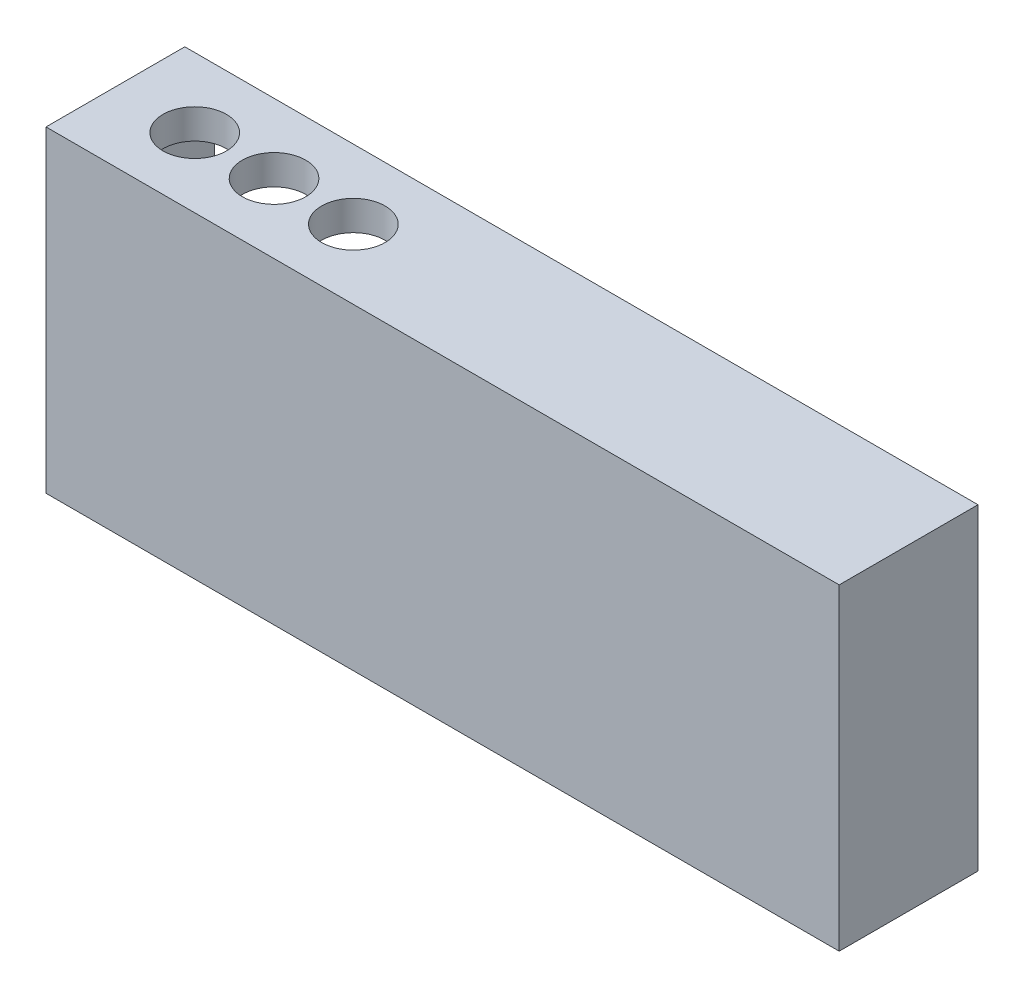
ISO-10303-21;
HEADER;
FILE_DESCRIPTION(('STEP AP214'),'2;1');
FILE_NAME('part.step','',(''),(''),'','','');
FILE_SCHEMA(('AUTOMOTIVE_DESIGN { 1 0 10303 214 1 1 1 1 }'));
ENDSEC;
DATA;
#1=APPLICATION_CONTEXT('core data for automotive mechanical design processes');
#2=APPLICATION_PROTOCOL_DEFINITION('international standard','automotive_design',2000,#1);
#3=PRODUCT_CONTEXT('',#1,'mechanical');
#4=PRODUCT('Part','Part','',(#3));
#5=PRODUCT_RELATED_PRODUCT_CATEGORY('part','',(#4));
#6=PRODUCT_DEFINITION_FORMATION('','',#4);
#7=PRODUCT_DEFINITION_CONTEXT('part definition',#1,'design');
#8=PRODUCT_DEFINITION('design','',#6,#7);
#9=PRODUCT_DEFINITION_SHAPE('','',#8);
#10=(LENGTH_UNIT() NAMED_UNIT(*) SI_UNIT(.MILLI.,.METRE.));
#11=(NAMED_UNIT(*) PLANE_ANGLE_UNIT() SI_UNIT($,.RADIAN.));
#12=(NAMED_UNIT(*) SI_UNIT($,.STERADIAN.) SOLID_ANGLE_UNIT());
#13=UNCERTAINTY_MEASURE_WITH_UNIT(LENGTH_MEASURE(1.E-05),#10,'distance_accuracy_value','');
#14=(GEOMETRIC_REPRESENTATION_CONTEXT(3) GLOBAL_UNCERTAINTY_ASSIGNED_CONTEXT((#13)) GLOBAL_UNIT_ASSIGNED_CONTEXT((#10,
#11,#12)) REPRESENTATION_CONTEXT('',''));
#15=CARTESIAN_POINT('',(0.,0.,0.));
#16=DIRECTION('',(0.,0.,1.));
#17=DIRECTION('',(1.,0.,0.));
#18=AXIS2_PLACEMENT_3D('',#15,#16,#17);
#19=CARTESIAN_POINT('',(100.,-40.,35.));
#20=DIRECTION('',(-1.,0.,0.));
#21=DIRECTION('',(0.,0.,1.));
#22=AXIS2_PLACEMENT_3D('',#19,#20,#21);
#23=PLANE('',#22);
#24=DIRECTION('',(0.,1.,0.));
#25=VECTOR('',#24,1.);
#26=CARTESIAN_POINT('',(100.,-40.,0.));
#27=LINE('',#26,#25);
#28=CARTESIAN_POINT('',(100.,-40.,0.));
#29=VERTEX_POINT('',#28);
#30=CARTESIAN_POINT('',(100.,40.,0.));
#31=VERTEX_POINT('',#30);
#32=EDGE_CURVE('E144',#29,#31,#27,.T.);
#33=ORIENTED_EDGE('',*,*,#32,.T.);
#34=DIRECTION('',(0.,0.,-1.));
#35=VECTOR('',#34,1.);
#36=CARTESIAN_POINT('',(100.,40.,35.));
#37=LINE('',#36,#35);
#38=CARTESIAN_POINT('',(100.,40.,35.));
#39=VERTEX_POINT('',#38);
#40=EDGE_CURVE('E11',#39,#31,#37,.T.);
#41=ORIENTED_EDGE('',*,*,#40,.F.);
#42=DIRECTION('',(0.,1.,0.));
#43=VECTOR('',#42,1.);
#44=CARTESIAN_POINT('',(100.,-40.,35.));
#45=LINE('',#44,#43);
#46=CARTESIAN_POINT('',(100.,-40.,35.));
#47=VERTEX_POINT('',#46);
#48=EDGE_CURVE('E148',#47,#39,#45,.T.);
#49=ORIENTED_EDGE('',*,*,#48,.F.);
#50=DIRECTION('',(0.,0.,-1.));
#51=VECTOR('',#50,1.);
#52=CARTESIAN_POINT('',(100.,-40.,35.));
#53=LINE('',#52,#51);
#54=EDGE_CURVE('E154',#47,#29,#53,.T.);
#55=ORIENTED_EDGE('',*,*,#54,.T.);
#56=EDGE_LOOP('',(#33,#41,#49,#55));
#57=FACE_BOUND('',#56,.T.);
#58=ADVANCED_FACE('F32',(#57),#23,.F.);
#59=CARTESIAN_POINT('',(-100.,40.,35.));
#60=DIRECTION('',(0.,-1.,0.));
#61=DIRECTION('',(0.,0.,-1.));
#62=AXIS2_PLACEMENT_3D('',#59,#60,#61);
#63=PLANE('',#62);
#64=CARTESIAN_POINT('',(-40.,40.,17.5));
#65=DIRECTION('',(0.,1.,0.));
#66=DIRECTION('',(0.,0.,1.));
#67=AXIS2_PLACEMENT_3D('',#64,#65,#66);
#68=CIRCLE('',#67,8.);
#69=CARTESIAN_POINT('',(-40.,40.,25.5));
#70=VERTEX_POINT('',#69);
#71=EDGE_CURVE('E200',#70,#70,#68,.T.);
#72=ORIENTED_EDGE('',*,*,#71,.F.);
#73=EDGE_LOOP('',(#72));
#74=FACE_BOUND('',#73,.T.);
#75=CARTESIAN_POINT('',(-60.,40.,17.5));
#76=DIRECTION('',(0.,1.,0.));
#77=DIRECTION('',(0.,0.,1.));
#78=AXIS2_PLACEMENT_3D('',#75,#76,#77);
#79=CIRCLE('',#78,8.);
#80=CARTESIAN_POINT('',(-60.,40.,25.5));
#81=VERTEX_POINT('',#80);
#82=EDGE_CURVE('E204',#81,#81,#79,.T.);
#83=ORIENTED_EDGE('',*,*,#82,.F.);
#84=EDGE_LOOP('',(#83));
#85=FACE_BOUND('',#84,.T.);
#86=CARTESIAN_POINT('',(-80.,40.,17.5));
#87=DIRECTION('',(0.,1.,0.));
#88=DIRECTION('',(0.,0.,1.));
#89=AXIS2_PLACEMENT_3D('',#86,#87,#88);
#90=CIRCLE('',#89,8.);
#91=CARTESIAN_POINT('',(-80.,40.,25.5));
#92=VERTEX_POINT('',#91);
#93=EDGE_CURVE('E131',#92,#92,#90,.T.);
#94=ORIENTED_EDGE('',*,*,#93,.F.);
#95=EDGE_LOOP('',(#94));
#96=FACE_BOUND('',#95,.T.);
#97=DIRECTION('',(-1.,0.,0.));
#98=VECTOR('',#97,1.);
#99=CARTESIAN_POINT('',(-100.,40.,0.));
#100=LINE('',#99,#98);
#101=CARTESIAN_POINT('',(-100.,40.,0.));
#102=VERTEX_POINT('',#101);
#103=EDGE_CURVE('E157',#31,#102,#100,.T.);
#104=ORIENTED_EDGE('',*,*,#103,.T.);
#105=DIRECTION('',(0.,0.,-1.));
#106=VECTOR('',#105,1.);
#107=CARTESIAN_POINT('',(-100.,40.,35.));
#108=LINE('',#107,#106);
#109=CARTESIAN_POINT('',(-100.,40.,35.));
#110=VERTEX_POINT('',#109);
#111=EDGE_CURVE('E39',#110,#102,#108,.T.);
#112=ORIENTED_EDGE('',*,*,#111,.F.);
#113=DIRECTION('',(-1.,0.,0.));
#114=VECTOR('',#113,1.);
#115=CARTESIAN_POINT('',(-100.,40.,35.));
#116=LINE('',#115,#114);
#117=EDGE_CURVE('E83',#39,#110,#116,.T.);
#118=ORIENTED_EDGE('',*,*,#117,.F.);
#119=ORIENTED_EDGE('',*,*,#40,.T.);
#120=EDGE_LOOP('',(#104,#112,#118,#119));
#121=FACE_BOUND('',#120,.T.);
#122=ADVANCED_FACE('F186',(#74,#85,#96,#121),#63,.F.);
#123=CARTESIAN_POINT('',(-100.,-40.,35.));
#124=DIRECTION('',(1.,0.,0.));
#125=DIRECTION('',(0.,0.,-1.));
#126=AXIS2_PLACEMENT_3D('',#123,#124,#125);
#127=PLANE('',#126);
#128=DIRECTION('',(0.,-1.,0.));
#129=VECTOR('',#128,1.);
#130=CARTESIAN_POINT('',(-100.,-40.,0.));
#131=LINE('',#130,#129);
#132=CARTESIAN_POINT('',(-100.,-40.,0.));
#133=VERTEX_POINT('',#132);
#134=EDGE_CURVE('E159',#102,#133,#131,.T.);
#135=ORIENTED_EDGE('',*,*,#134,.T.);
#136=DIRECTION('',(0.,0.,-1.));
#137=VECTOR('',#136,1.);
#138=CARTESIAN_POINT('',(-100.,-40.,35.));
#139=LINE('',#138,#137);
#140=CARTESIAN_POINT('',(-100.,-40.,35.));
#141=VERTEX_POINT('',#140);
#142=EDGE_CURVE('E163',#141,#133,#139,.T.);
#143=ORIENTED_EDGE('',*,*,#142,.F.);
#144=DIRECTION('',(0.,-1.,0.));
#145=VECTOR('',#144,1.);
#146=CARTESIAN_POINT('',(-100.,-40.,35.));
#147=LINE('',#146,#145);
#148=EDGE_CURVE('E151',#110,#141,#147,.T.);
#149=ORIENTED_EDGE('',*,*,#148,.F.);
#150=ORIENTED_EDGE('',*,*,#111,.T.);
#151=EDGE_LOOP('',(#135,#143,#149,#150));
#152=FACE_BOUND('',#151,.T.);
#153=ADVANCED_FACE('F168',(#152),#127,.F.);
#154=CARTESIAN_POINT('',(-100.,-40.,35.));
#155=DIRECTION('',(0.,1.,0.));
#156=DIRECTION('',(0.,0.,1.));
#157=AXIS2_PLACEMENT_3D('',#154,#155,#156);
#158=PLANE('',#157);
#159=CARTESIAN_POINT('',(80.,-40.,17.5));
#160=DIRECTION('',(0.,-1.,0.));
#161=DIRECTION('',(0.,0.,-1.));
#162=AXIS2_PLACEMENT_3D('',#159,#160,#161);
#163=CIRCLE('',#162,5.40000000000001);
#164=CARTESIAN_POINT('',(80.,-40.,12.1));
#165=VERTEX_POINT('',#164);
#166=EDGE_CURVE('E221',#165,#165,#163,.T.);
#167=ORIENTED_EDGE('',*,*,#166,.F.);
#168=EDGE_LOOP('',(#167));
#169=FACE_BOUND('',#168,.T.);
#170=DIRECTION('',(1.,0.,0.));
#171=VECTOR('',#170,1.);
#172=CARTESIAN_POINT('',(-100.,-40.,0.));
#173=LINE('',#172,#171);
#174=EDGE_CURVE('E76',#133,#29,#173,.T.);
#175=ORIENTED_EDGE('',*,*,#174,.T.);
#176=ORIENTED_EDGE('',*,*,#54,.F.);
#177=DIRECTION('',(1.,0.,0.));
#178=VECTOR('',#177,1.);
#179=CARTESIAN_POINT('',(-100.,-40.,35.));
#180=LINE('',#179,#178);
#181=EDGE_CURVE('E55',#141,#47,#180,.T.);
#182=ORIENTED_EDGE('',*,*,#181,.F.);
#183=ORIENTED_EDGE('',*,*,#142,.T.);
#184=EDGE_LOOP('',(#175,#176,#182,#183));
#185=FACE_BOUND('',#184,.T.);
#186=ADVANCED_FACE('F176',(#169,#185),#158,.F.);
#187=CARTESIAN_POINT('',(0.,0.,35.));
#188=DIRECTION('',(0.,0.,-1.));
#189=DIRECTION('',(-1.,0.,0.));
#190=AXIS2_PLACEMENT_3D('',#187,#188,#189);
#191=PLANE('',#190);
#192=ORIENTED_EDGE('',*,*,#48,.T.);
#193=ORIENTED_EDGE('',*,*,#117,.T.);
#194=ORIENTED_EDGE('',*,*,#148,.T.);
#195=ORIENTED_EDGE('',*,*,#181,.T.);
#196=EDGE_LOOP('',(#192,#193,#194,#195));
#197=FACE_BOUND('',#196,.T.);
#198=ADVANCED_FACE('F178',(#197),#191,.F.);
#199=CARTESIAN_POINT('',(0.,0.,0.));
#200=DIRECTION('',(0.,0.,-1.));
#201=DIRECTION('',(-1.,0.,0.));
#202=AXIS2_PLACEMENT_3D('',#199,#200,#201);
#203=PLANE('',#202);
#204=CARTESIAN_POINT('',(96.25,-36.2500000000013,0.));
#205=DIRECTION('',(0.,0.,-1.));
#206=DIRECTION('',(-1.,0.,0.));
#207=AXIS2_PLACEMENT_3D('',#204,#205,#206);
#208=CIRCLE('',#207,2.50919292045025);
#209=CARTESIAN_POINT('',(93.7408070795498,-36.2500000000013,0.));
#210=VERTEX_POINT('',#209);
#211=EDGE_CURVE('E245',#210,#210,#208,.T.);
#212=ORIENTED_EDGE('',*,*,#211,.F.);
#213=EDGE_LOOP('',(#212));
#214=FACE_BOUND('',#213,.T.);
#215=CARTESIAN_POINT('',(96.2500000000003,36.2499999999987,0.));
#216=DIRECTION('',(0.,0.,-1.));
#217=DIRECTION('',(-1.,0.,0.));
#218=AXIS2_PLACEMENT_3D('',#215,#216,#217);
#219=CIRCLE('',#218,2.50919292045025);
#220=CARTESIAN_POINT('',(93.74080707955,36.2499999999987,0.));
#221=VERTEX_POINT('',#220);
#222=EDGE_CURVE('E239',#221,#221,#219,.T.);
#223=ORIENTED_EDGE('',*,*,#222,.F.);
#224=EDGE_LOOP('',(#223));
#225=FACE_BOUND('',#224,.T.);
#226=CARTESIAN_POINT('',(-96.2499999999998,36.25,0.));
#227=DIRECTION('',(0.,0.,-1.));
#228=DIRECTION('',(-1.,0.,0.));
#229=AXIS2_PLACEMENT_3D('',#226,#227,#228);
#230=CIRCLE('',#229,2.50919292045025);
#231=CARTESIAN_POINT('',(-98.75919292045,36.25,0.));
#232=VERTEX_POINT('',#231);
#233=EDGE_CURVE('E233',#232,#232,#230,.T.);
#234=ORIENTED_EDGE('',*,*,#233,.F.);
#235=EDGE_LOOP('',(#234));
#236=FACE_BOUND('',#235,.T.);
#237=CARTESIAN_POINT('',(-96.25,-36.25,0.));
#238=DIRECTION('',(0.,0.,-1.));
#239=DIRECTION('',(-1.,0.,0.));
#240=AXIS2_PLACEMENT_3D('',#237,#238,#239);
#241=CIRCLE('',#240,2.50919292045025);
#242=CARTESIAN_POINT('',(-98.7591929204502,-36.25,0.));
#243=VERTEX_POINT('',#242);
#244=EDGE_CURVE('E227',#243,#243,#241,.T.);
#245=ORIENTED_EDGE('',*,*,#244,.F.);
#246=EDGE_LOOP('',(#245));
#247=FACE_BOUND('',#246,.T.);
#248=DIRECTION('',(0.,1.,0.));
#249=VECTOR('',#248,1.);
#250=CARTESIAN_POINT('',(-92.5,-32.5,0.));
#251=LINE('',#250,#249);
#252=CARTESIAN_POINT('',(-92.5,-32.5,0.));
#253=VERTEX_POINT('',#252);
#254=CARTESIAN_POINT('',(-92.5,32.5,0.));
#255=VERTEX_POINT('',#254);
#256=EDGE_CURVE('E46',#253,#255,#251,.T.);
#257=ORIENTED_EDGE('',*,*,#256,.F.);
#258=DIRECTION('',(-1.,0.,0.));
#259=VECTOR('',#258,1.);
#260=CARTESIAN_POINT('',(92.5,-32.5,0.));
#261=LINE('',#260,#259);
#262=CARTESIAN_POINT('',(92.5,-32.5,0.));
#263=VERTEX_POINT('',#262);
#264=EDGE_CURVE('E125',#263,#253,#261,.T.);
#265=ORIENTED_EDGE('',*,*,#264,.F.);
#266=DIRECTION('',(0.,-1.,0.));
#267=VECTOR('',#266,1.);
#268=CARTESIAN_POINT('',(92.5,-32.5,0.));
#269=LINE('',#268,#267);
#270=CARTESIAN_POINT('',(92.5,32.5,0.));
#271=VERTEX_POINT('',#270);
#272=EDGE_CURVE('E128',#271,#263,#269,.T.);
#273=ORIENTED_EDGE('',*,*,#272,.F.);
#274=DIRECTION('',(1.,0.,0.));
#275=VECTOR('',#274,1.);
#276=CARTESIAN_POINT('',(92.5,32.5,0.));
#277=LINE('',#276,#275);
#278=EDGE_CURVE('E137',#255,#271,#277,.T.);
#279=ORIENTED_EDGE('',*,*,#278,.F.);
#280=EDGE_LOOP('',(#257,#265,#273,#279));
#281=FACE_BOUND('',#280,.T.);
#282=ORIENTED_EDGE('',*,*,#32,.F.);
#283=ORIENTED_EDGE('',*,*,#174,.F.);
#284=ORIENTED_EDGE('',*,*,#134,.F.);
#285=ORIENTED_EDGE('',*,*,#103,.F.);
#286=EDGE_LOOP('',(#282,#283,#284,#285));
#287=FACE_BOUND('',#286,.T.);
#288=ADVANCED_FACE('F172',(#214,#225,#236,#247,#281,#287),#203,.T.);
#289=CARTESIAN_POINT('',(-92.5,-32.5,27.5));
#290=DIRECTION('',(-1.,0.,0.));
#291=DIRECTION('',(0.,0.,1.));
#292=AXIS2_PLACEMENT_3D('',#289,#290,#291);
#293=PLANE('',#292);
#294=ORIENTED_EDGE('',*,*,#256,.T.);
#295=DIRECTION('',(0.,0.,-1.));
#296=VECTOR('',#295,1.);
#297=CARTESIAN_POINT('',(-92.5,32.5,27.5));
#298=LINE('',#297,#296);
#299=CARTESIAN_POINT('',(-92.5,32.5,27.5));
#300=VERTEX_POINT('',#299);
#301=EDGE_CURVE('E103',#300,#255,#298,.T.);
#302=ORIENTED_EDGE('',*,*,#301,.F.);
#303=DIRECTION('',(0.,1.,0.));
#304=VECTOR('',#303,1.);
#305=CARTESIAN_POINT('',(-92.5,-32.5,27.5));
#306=LINE('',#305,#304);
#307=CARTESIAN_POINT('',(-92.5,-32.5,27.5));
#308=VERTEX_POINT('',#307);
#309=EDGE_CURVE('E107',#308,#300,#306,.T.);
#310=ORIENTED_EDGE('',*,*,#309,.F.);
#311=DIRECTION('',(0.,0.,-1.));
#312=VECTOR('',#311,1.);
#313=CARTESIAN_POINT('',(-92.5,-32.5,27.5));
#314=LINE('',#313,#312);
#315=EDGE_CURVE('E142',#308,#253,#314,.T.);
#316=ORIENTED_EDGE('',*,*,#315,.T.);
#317=EDGE_LOOP('',(#294,#302,#310,#316));
#318=FACE_BOUND('',#317,.T.);
#319=ADVANCED_FACE('F105',(#318),#293,.F.);
#320=CARTESIAN_POINT('',(92.5,-32.5,27.5));
#321=DIRECTION('',(0.,-1.,0.));
#322=DIRECTION('',(0.,0.,-1.));
#323=AXIS2_PLACEMENT_3D('',#320,#321,#322);
#324=PLANE('',#323);
#325=CARTESIAN_POINT('',(80.,-32.5,17.5));
#326=DIRECTION('',(0.,-1.,0.));
#327=DIRECTION('',(0.,0.,-1.));
#328=AXIS2_PLACEMENT_3D('',#325,#326,#327);
#329=CIRCLE('',#328,5.40000000000001);
#330=CARTESIAN_POINT('',(80.,-32.5,12.1));
#331=VERTEX_POINT('',#330);
#332=EDGE_CURVE('E218',#331,#331,#329,.T.);
#333=ORIENTED_EDGE('',*,*,#332,.T.);
#334=EDGE_LOOP('',(#333));
#335=FACE_BOUND('',#334,.T.);
#336=ORIENTED_EDGE('',*,*,#264,.T.);
#337=ORIENTED_EDGE('',*,*,#315,.F.);
#338=DIRECTION('',(-1.,0.,0.));
#339=VECTOR('',#338,1.);
#340=CARTESIAN_POINT('',(92.5,-32.5,27.5));
#341=LINE('',#340,#339);
#342=CARTESIAN_POINT('',(92.5,-32.5,27.5));
#343=VERTEX_POINT('',#342);
#344=EDGE_CURVE('E113',#343,#308,#341,.T.);
#345=ORIENTED_EDGE('',*,*,#344,.F.);
#346=DIRECTION('',(0.,0.,-1.));
#347=VECTOR('',#346,1.);
#348=CARTESIAN_POINT('',(92.5,-32.5,27.5));
#349=LINE('',#348,#347);
#350=EDGE_CURVE('E145',#343,#263,#349,.T.);
#351=ORIENTED_EDGE('',*,*,#350,.T.);
#352=EDGE_LOOP('',(#336,#337,#345,#351));
#353=FACE_BOUND('',#352,.T.);
#354=ADVANCED_FACE('F273',(#335,#353),#324,.F.);
#355=CARTESIAN_POINT('',(92.5,-32.5,27.5));
#356=DIRECTION('',(1.,0.,0.));
#357=DIRECTION('',(0.,0.,-1.));
#358=AXIS2_PLACEMENT_3D('',#355,#356,#357);
#359=PLANE('',#358);
#360=ORIENTED_EDGE('',*,*,#272,.T.);
#361=ORIENTED_EDGE('',*,*,#350,.F.);
#362=DIRECTION('',(0.,-1.,0.));
#363=VECTOR('',#362,1.);
#364=CARTESIAN_POINT('',(92.5,-32.5,27.5));
#365=LINE('',#364,#363);
#366=CARTESIAN_POINT('',(92.5,32.5,27.5));
#367=VERTEX_POINT('',#366);
#368=EDGE_CURVE('E121',#367,#343,#365,.T.);
#369=ORIENTED_EDGE('',*,*,#368,.F.);
#370=DIRECTION('',(0.,0.,-1.));
#371=VECTOR('',#370,1.);
#372=CARTESIAN_POINT('',(92.5,32.5,27.5));
#373=LINE('',#372,#371);
#374=EDGE_CURVE('E112',#367,#271,#373,.T.);
#375=ORIENTED_EDGE('',*,*,#374,.T.);
#376=EDGE_LOOP('',(#360,#361,#369,#375));
#377=FACE_BOUND('',#376,.T.);
#378=ADVANCED_FACE('F271',(#377),#359,.F.);
#379=CARTESIAN_POINT('',(92.5,32.5,27.5));
#380=DIRECTION('',(0.,1.,0.));
#381=DIRECTION('',(0.,0.,1.));
#382=AXIS2_PLACEMENT_3D('',#379,#380,#381);
#383=PLANE('',#382);
#384=CARTESIAN_POINT('',(-40.,32.5,17.5));
#385=DIRECTION('',(0.,1.,0.));
#386=DIRECTION('',(0.,0.,1.));
#387=AXIS2_PLACEMENT_3D('',#384,#385,#386);
#388=CIRCLE('',#387,8.);
#389=CARTESIAN_POINT('',(-40.,32.5,25.5));
#390=VERTEX_POINT('',#389);
#391=EDGE_CURVE('E214',#390,#390,#388,.T.);
#392=ORIENTED_EDGE('',*,*,#391,.T.);
#393=EDGE_LOOP('',(#392));
#394=FACE_BOUND('',#393,.T.);
#395=CARTESIAN_POINT('',(-60.,32.5,17.5));
#396=DIRECTION('',(0.,1.,0.));
#397=DIRECTION('',(0.,0.,1.));
#398=AXIS2_PLACEMENT_3D('',#395,#396,#397);
#399=CIRCLE('',#398,8.);
#400=CARTESIAN_POINT('',(-60.,32.5,25.5));
#401=VERTEX_POINT('',#400);
#402=EDGE_CURVE('E208',#401,#401,#399,.T.);
#403=ORIENTED_EDGE('',*,*,#402,.T.);
#404=EDGE_LOOP('',(#403));
#405=FACE_BOUND('',#404,.T.);
#406=CARTESIAN_POINT('',(-80.,32.5,17.5));
#407=DIRECTION('',(0.,1.,0.));
#408=DIRECTION('',(0.,0.,1.));
#409=AXIS2_PLACEMENT_3D('',#406,#407,#408);
#410=CIRCLE('',#409,8.);
#411=CARTESIAN_POINT('',(-80.,32.5,25.5));
#412=VERTEX_POINT('',#411);
#413=EDGE_CURVE('E138',#412,#412,#410,.T.);
#414=ORIENTED_EDGE('',*,*,#413,.T.);
#415=EDGE_LOOP('',(#414));
#416=FACE_BOUND('',#415,.T.);
#417=ORIENTED_EDGE('',*,*,#278,.T.);
#418=ORIENTED_EDGE('',*,*,#374,.F.);
#419=DIRECTION('',(1.,0.,0.));
#420=VECTOR('',#419,1.);
#421=CARTESIAN_POINT('',(92.5,32.5,27.5));
#422=LINE('',#421,#420);
#423=EDGE_CURVE('E116',#300,#367,#422,.T.);
#424=ORIENTED_EDGE('',*,*,#423,.F.);
#425=ORIENTED_EDGE('',*,*,#301,.T.);
#426=EDGE_LOOP('',(#417,#418,#424,#425));
#427=FACE_BOUND('',#426,.T.);
#428=ADVANCED_FACE('F117',(#394,#405,#416,#427),#383,.F.);
#429=CARTESIAN_POINT('',(0.,0.,27.5));
#430=DIRECTION('',(0.,0.,1.));
#431=DIRECTION('',(1.,0.,0.));
#432=AXIS2_PLACEMENT_3D('',#429,#430,#431);
#433=PLANE('',#432);
#434=ORIENTED_EDGE('',*,*,#309,.T.);
#435=ORIENTED_EDGE('',*,*,#423,.T.);
#436=ORIENTED_EDGE('',*,*,#368,.T.);
#437=ORIENTED_EDGE('',*,*,#344,.T.);
#438=EDGE_LOOP('',(#434,#435,#436,#437));
#439=FACE_BOUND('',#438,.T.);
#440=ADVANCED_FACE('F123',(#439),#433,.F.);
#441=CARTESIAN_POINT('',(-80.,32.5,17.5));
#442=DIRECTION('',(0.,1.,0.));
#443=DIRECTION('',(0.,0.,1.));
#444=AXIS2_PLACEMENT_3D('',#441,#442,#443);
#445=CYLINDRICAL_SURFACE('',#444,8.);
#446=ORIENTED_EDGE('',*,*,#413,.F.);
#447=EDGE_LOOP('',(#446));
#448=FACE_BOUND('',#447,.T.);
#449=ORIENTED_EDGE('',*,*,#93,.T.);
#450=EDGE_LOOP('',(#449));
#451=FACE_BOUND('',#450,.T.);
#452=ADVANCED_FACE('F291',(#448,#451),#445,.F.);
#453=CARTESIAN_POINT('',(-60.,32.5,17.5));
#454=DIRECTION('',(0.,1.,0.));
#455=DIRECTION('',(0.,0.,1.));
#456=AXIS2_PLACEMENT_3D('',#453,#454,#455);
#457=CYLINDRICAL_SURFACE('',#456,8.);
#458=ORIENTED_EDGE('',*,*,#402,.F.);
#459=EDGE_LOOP('',(#458));
#460=FACE_BOUND('',#459,.T.);
#461=ORIENTED_EDGE('',*,*,#82,.T.);
#462=EDGE_LOOP('',(#461));
#463=FACE_BOUND('',#462,.T.);
#464=ADVANCED_FACE('F297',(#460,#463),#457,.F.);
#465=CARTESIAN_POINT('',(-40.,32.5,17.5));
#466=DIRECTION('',(0.,1.,0.));
#467=DIRECTION('',(0.,0.,1.));
#468=AXIS2_PLACEMENT_3D('',#465,#466,#467);
#469=CYLINDRICAL_SURFACE('',#468,8.);
#470=ORIENTED_EDGE('',*,*,#391,.F.);
#471=EDGE_LOOP('',(#470));
#472=FACE_BOUND('',#471,.T.);
#473=ORIENTED_EDGE('',*,*,#71,.T.);
#474=EDGE_LOOP('',(#473));
#475=FACE_BOUND('',#474,.T.);
#476=ADVANCED_FACE('F301',(#472,#475),#469,.F.);
#477=CARTESIAN_POINT('',(80.,-32.5,17.5));
#478=DIRECTION('',(0.,-1.,0.));
#479=DIRECTION('',(0.,0.,-1.));
#480=AXIS2_PLACEMENT_3D('',#477,#478,#479);
#481=CYLINDRICAL_SURFACE('',#480,5.40000000000001);
#482=ORIENTED_EDGE('',*,*,#332,.F.);
#483=EDGE_LOOP('',(#482));
#484=FACE_BOUND('',#483,.T.);
#485=ORIENTED_EDGE('',*,*,#166,.T.);
#486=EDGE_LOOP('',(#485));
#487=FACE_BOUND('',#486,.T.);
#488=ADVANCED_FACE('F307',(#484,#487),#481,.F.);
#489=CARTESIAN_POINT('',(-96.25,-36.25,2.));
#490=DIRECTION('',(0.,0.,-1.));
#491=DIRECTION('',(-1.,0.,0.));
#492=AXIS2_PLACEMENT_3D('',#489,#490,#491);
#493=CYLINDRICAL_SURFACE('',#492,2.50919292045025);
#494=CARTESIAN_POINT('',(-96.25,-36.25,2.));
#495=DIRECTION('',(0.,0.,-1.));
#496=DIRECTION('',(-1.,0.,0.));
#497=AXIS2_PLACEMENT_3D('',#494,#495,#496);
#498=CIRCLE('',#497,2.50919292045025);
#499=CARTESIAN_POINT('',(-98.7591929204502,-36.25,2.));
#500=VERTEX_POINT('',#499);
#501=EDGE_CURVE('E224',#500,#500,#498,.T.);
#502=ORIENTED_EDGE('',*,*,#501,.F.);
#503=EDGE_LOOP('',(#502));
#504=FACE_BOUND('',#503,.T.);
#505=ORIENTED_EDGE('',*,*,#244,.T.);
#506=EDGE_LOOP('',(#505));
#507=FACE_BOUND('',#506,.T.);
#508=ADVANCED_FACE('F311',(#504,#507),#493,.F.);
#509=CARTESIAN_POINT('',(0.,0.,2.));
#510=DIRECTION('',(0.,0.,-1.));
#511=DIRECTION('',(-1.,0.,0.));
#512=AXIS2_PLACEMENT_3D('',#509,#510,#511);
#513=PLANE('',#512);
#514=ORIENTED_EDGE('',*,*,#501,.T.);
#515=EDGE_LOOP('',(#514));
#516=FACE_BOUND('',#515,.T.);
#517=ADVANCED_FACE('F315',(#516),#513,.T.);
#518=CARTESIAN_POINT('',(-96.2499999999998,36.25,2.));
#519=DIRECTION('',(0.,0.,-1.));
#520=DIRECTION('',(-1.,0.,0.));
#521=AXIS2_PLACEMENT_3D('',#518,#519,#520);
#522=CYLINDRICAL_SURFACE('',#521,2.50919292045025);
#523=CARTESIAN_POINT('',(-96.2499999999998,36.25,2.));
#524=DIRECTION('',(0.,0.,-1.));
#525=DIRECTION('',(-1.,0.,0.));
#526=AXIS2_PLACEMENT_3D('',#523,#524,#525);
#527=CIRCLE('',#526,2.50919292045025);
#528=CARTESIAN_POINT('',(-98.75919292045,36.25,2.));
#529=VERTEX_POINT('',#528);
#530=EDGE_CURVE('E230',#529,#529,#527,.T.);
#531=ORIENTED_EDGE('',*,*,#530,.F.);
#532=EDGE_LOOP('',(#531));
#533=FACE_BOUND('',#532,.T.);
#534=ORIENTED_EDGE('',*,*,#233,.T.);
#535=EDGE_LOOP('',(#534));
#536=FACE_BOUND('',#535,.T.);
#537=ADVANCED_FACE('F319',(#533,#536),#522,.F.);
#538=CARTESIAN_POINT('',(0.,0.,2.));
#539=DIRECTION('',(0.,0.,-1.));
#540=DIRECTION('',(-1.,0.,0.));
#541=AXIS2_PLACEMENT_3D('',#538,#539,#540);
#542=PLANE('',#541);
#543=ORIENTED_EDGE('',*,*,#530,.T.);
#544=EDGE_LOOP('',(#543));
#545=FACE_BOUND('',#544,.T.);
#546=ADVANCED_FACE('F323',(#545),#542,.T.);
#547=CARTESIAN_POINT('',(96.2500000000003,36.2499999999987,2.));
#548=DIRECTION('',(0.,0.,-1.));
#549=DIRECTION('',(-1.,0.,0.));
#550=AXIS2_PLACEMENT_3D('',#547,#548,#549);
#551=CYLINDRICAL_SURFACE('',#550,2.50919292045025);
#552=CARTESIAN_POINT('',(96.2500000000003,36.2499999999987,2.));
#553=DIRECTION('',(0.,0.,-1.));
#554=DIRECTION('',(-1.,0.,0.));
#555=AXIS2_PLACEMENT_3D('',#552,#553,#554);
#556=CIRCLE('',#555,2.50919292045025);
#557=CARTESIAN_POINT('',(93.74080707955,36.2499999999987,2.));
#558=VERTEX_POINT('',#557);
#559=EDGE_CURVE('E236',#558,#558,#556,.T.);
#560=ORIENTED_EDGE('',*,*,#559,.F.);
#561=EDGE_LOOP('',(#560));
#562=FACE_BOUND('',#561,.T.);
#563=ORIENTED_EDGE('',*,*,#222,.T.);
#564=EDGE_LOOP('',(#563));
#565=FACE_BOUND('',#564,.T.);
#566=ADVANCED_FACE('F327',(#562,#565),#551,.F.);
#567=CARTESIAN_POINT('',(0.,0.,2.));
#568=DIRECTION('',(0.,0.,-1.));
#569=DIRECTION('',(-1.,0.,0.));
#570=AXIS2_PLACEMENT_3D('',#567,#568,#569);
#571=PLANE('',#570);
#572=ORIENTED_EDGE('',*,*,#559,.T.);
#573=EDGE_LOOP('',(#572));
#574=FACE_BOUND('',#573,.T.);
#575=ADVANCED_FACE('F256',(#574),#571,.T.);
#576=CARTESIAN_POINT('',(96.25,-36.2500000000013,2.));
#577=DIRECTION('',(0.,0.,-1.));
#578=DIRECTION('',(-1.,0.,0.));
#579=AXIS2_PLACEMENT_3D('',#576,#577,#578);
#580=CYLINDRICAL_SURFACE('',#579,2.50919292045025);
#581=CARTESIAN_POINT('',(96.25,-36.2500000000013,2.));
#582=DIRECTION('',(0.,0.,-1.));
#583=DIRECTION('',(-1.,0.,0.));
#584=AXIS2_PLACEMENT_3D('',#581,#582,#583);
#585=CIRCLE('',#584,2.50919292045025);
#586=CARTESIAN_POINT('',(93.7408070795498,-36.2500000000013,2.));
#587=VERTEX_POINT('',#586);
#588=EDGE_CURVE('E242',#587,#587,#585,.T.);
#589=ORIENTED_EDGE('',*,*,#588,.F.);
#590=EDGE_LOOP('',(#589));
#591=FACE_BOUND('',#590,.T.);
#592=ORIENTED_EDGE('',*,*,#211,.T.);
#593=EDGE_LOOP('',(#592));
#594=FACE_BOUND('',#593,.T.);
#595=ADVANCED_FACE('F253',(#591,#594),#580,.F.);
#596=CARTESIAN_POINT('',(0.,0.,2.));
#597=DIRECTION('',(0.,0.,-1.));
#598=DIRECTION('',(-1.,0.,0.));
#599=AXIS2_PLACEMENT_3D('',#596,#597,#598);
#600=PLANE('',#599);
#601=ORIENTED_EDGE('',*,*,#588,.T.);
#602=EDGE_LOOP('',(#601));
#603=FACE_BOUND('',#602,.T.);
#604=ADVANCED_FACE('F251',(#603),#600,.T.);
#605=CLOSED_SHELL('',(#58,#122,#153,#186,#198,#288,#319,#354,#378,#428,#440,#452,#464,#476,#488,
#508,#517,#537,#546,#566,#575,#595,#604));
#606=MANIFOLD_SOLID_BREP('B2',#605);
#607=ADVANCED_BREP_SHAPE_REPRESENTATION('',(#18,#606),#14);
#608=SHAPE_DEFINITION_REPRESENTATION(#9,#607);
ENDSEC;
END-ISO-10303-21;
